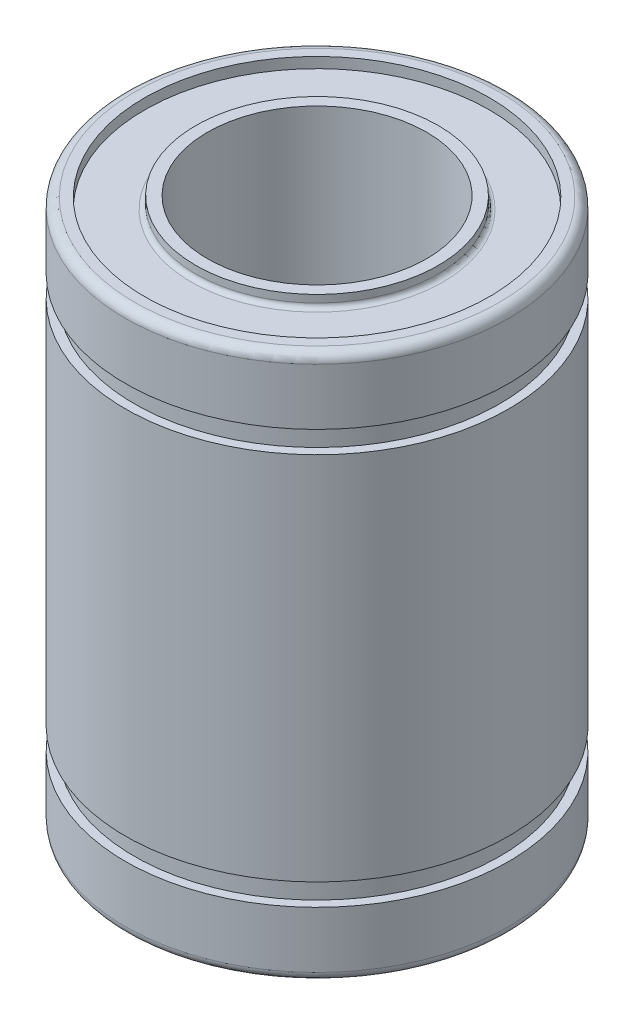
ISO-10303-21;
HEADER;
FILE_DESCRIPTION(('STEP AP214'),'2;1');
FILE_NAME('part.step','',(''),(''),'','','');
FILE_SCHEMA(('AUTOMOTIVE_DESIGN { 1 0 10303 214 1 1 1 1 }'));
ENDSEC;
DATA;
#1=APPLICATION_CONTEXT('core data for automotive mechanical design processes');
#2=APPLICATION_PROTOCOL_DEFINITION('international standard','automotive_design',2000,#1);
#3=PRODUCT_CONTEXT('',#1,'mechanical');
#4=PRODUCT('Part','Part','',(#3));
#5=PRODUCT_RELATED_PRODUCT_CATEGORY('part','',(#4));
#6=PRODUCT_DEFINITION_FORMATION('','',#4);
#7=PRODUCT_DEFINITION_CONTEXT('part definition',#1,'design');
#8=PRODUCT_DEFINITION('design','',#6,#7);
#9=PRODUCT_DEFINITION_SHAPE('','',#8);
#10=(LENGTH_UNIT() NAMED_UNIT(*) SI_UNIT(.MILLI.,.METRE.));
#11=(NAMED_UNIT(*) PLANE_ANGLE_UNIT() SI_UNIT($,.RADIAN.));
#12=(NAMED_UNIT(*) SI_UNIT($,.STERADIAN.) SOLID_ANGLE_UNIT());
#13=UNCERTAINTY_MEASURE_WITH_UNIT(LENGTH_MEASURE(1.E-05),#10,'distance_accuracy_value','');
#14=(GEOMETRIC_REPRESENTATION_CONTEXT(3) GLOBAL_UNCERTAINTY_ASSIGNED_CONTEXT((#13)) GLOBAL_UNIT_ASSIGNED_CONTEXT((#10,
#11,#12)) REPRESENTATION_CONTEXT('',''));
#15=CARTESIAN_POINT('',(0.,0.,0.));
#16=DIRECTION('',(0.,0.,1.));
#17=DIRECTION('',(1.,0.,0.));
#18=AXIS2_PLACEMENT_3D('',#15,#16,#17);
#19=CARTESIAN_POINT('',(0.,15.0004,0.));
#20=DIRECTION('',(0.,-1.,0.));
#21=DIRECTION('',(0.,0.,-1.));
#22=AXIS2_PLACEMENT_3D('',#19,#20,#21);
#23=CYLINDRICAL_SURFACE('',#22,6.635);
#24=CARTESIAN_POINT('',(0.,15.0004,0.));
#25=DIRECTION('',(0.,-1.,0.));
#26=DIRECTION('',(0.,0.,-1.));
#27=AXIS2_PLACEMENT_3D('',#24,#25,#26);
#28=CIRCLE('',#27,6.635);
#29=CARTESIAN_POINT('',(0.,15.0004,-6.635));
#30=VERTEX_POINT('',#29);
#31=EDGE_CURVE('E107',#30,#30,#28,.T.);
#32=ORIENTED_EDGE('',*,*,#31,.T.);
#33=EDGE_LOOP('',(#32));
#34=FACE_BOUND('',#33,.T.);
#35=CARTESIAN_POINT('',(0.,14.594,0.));
#36=DIRECTION('',(0.,-1.,0.));
#37=DIRECTION('',(0.,0.,-1.));
#38=AXIS2_PLACEMENT_3D('',#35,#36,#37);
#39=CIRCLE('',#38,6.635);
#40=CARTESIAN_POINT('',(0.,14.594,-6.635));
#41=VERTEX_POINT('',#40);
#42=EDGE_CURVE('E10',#41,#41,#39,.T.);
#43=ORIENTED_EDGE('',*,*,#42,.F.);
#44=EDGE_LOOP('',(#43));
#45=FACE_BOUND('',#44,.T.);
#46=ADVANCED_FACE('F31',(#34,#45),#23,.T.);
#47=CARTESIAN_POINT('',(0.,14.594,0.));
#48=DIRECTION('',(0.,-1.,0.));
#49=DIRECTION('',(0.,0.,-1.));
#50=AXIS2_PLACEMENT_3D('',#47,#48,#49);
#51=TOROIDAL_SURFACE('',#50,6.889,0.254);
#52=ORIENTED_EDGE('',*,*,#42,.T.);
#53=EDGE_LOOP('',(#52));
#54=FACE_BOUND('',#53,.T.);
#55=CARTESIAN_POINT('',(0.,14.34,0.));
#56=DIRECTION('',(0.,-1.,0.));
#57=DIRECTION('',(0.,0.,-1.));
#58=AXIS2_PLACEMENT_3D('',#55,#56,#57);
#59=CIRCLE('',#58,6.88900000000006);
#60=CARTESIAN_POINT('',(0.,14.34,-6.88900000000006));
#61=VERTEX_POINT('',#60);
#62=EDGE_CURVE('E37',#61,#61,#59,.T.);
#63=ORIENTED_EDGE('',*,*,#62,.F.);
#64=EDGE_LOOP('',(#63));
#65=FACE_BOUND('',#64,.T.);
#66=ADVANCED_FACE('F125',(#54,#65),#51,.F.);
#67=CARTESIAN_POINT('',(9.435,14.34,0.));
#68=DIRECTION('',(0.,1.,0.));
#69=DIRECTION('',(0.,0.,1.));
#70=AXIS2_PLACEMENT_3D('',#67,#68,#69);
#71=PLANE('',#70);
#72=ORIENTED_EDGE('',*,*,#62,.T.);
#73=EDGE_LOOP('',(#72));
#74=FACE_BOUND('',#73,.T.);
#75=CARTESIAN_POINT('',(0.,14.34,0.));
#76=DIRECTION('',(0.,-1.,0.));
#77=DIRECTION('',(0.,0.,-1.));
#78=AXIS2_PLACEMENT_3D('',#75,#76,#77);
#79=CIRCLE('',#78,9.435);
#80=CARTESIAN_POINT('',(0.,14.34,-9.435));
#81=VERTEX_POINT('',#80);
#82=EDGE_CURVE('E41',#81,#81,#79,.T.);
#83=ORIENTED_EDGE('',*,*,#82,.F.);
#84=EDGE_LOOP('',(#83));
#85=FACE_BOUND('',#84,.T.);
#86=ADVANCED_FACE('F129',(#74,#85),#71,.T.);
#87=CARTESIAN_POINT('',(0.,15.0004,0.));
#88=DIRECTION('',(0.,-1.,0.));
#89=DIRECTION('',(0.,0.,-1.));
#90=AXIS2_PLACEMENT_3D('',#87,#88,#89);
#91=CYLINDRICAL_SURFACE('',#90,9.435);
#92=ORIENTED_EDGE('',*,*,#82,.T.);
#93=EDGE_LOOP('',(#92));
#94=FACE_BOUND('',#93,.T.);
#95=CARTESIAN_POINT('',(0.,14.92,0.));
#96=DIRECTION('',(0.,-1.,0.));
#97=DIRECTION('',(0.,0.,-1.));
#98=AXIS2_PLACEMENT_3D('',#95,#96,#97);
#99=CIRCLE('',#98,9.435);
#100=CARTESIAN_POINT('',(0.,14.92,-9.435));
#101=VERTEX_POINT('',#100);
#102=EDGE_CURVE('E45',#101,#101,#99,.T.);
#103=ORIENTED_EDGE('',*,*,#102,.F.);
#104=EDGE_LOOP('',(#103));
#105=FACE_BOUND('',#104,.T.);
#106=ADVANCED_FACE('F133',(#94,#105),#91,.F.);
#107=CARTESIAN_POINT('',(9.977,14.92,0.));
#108=DIRECTION('',(0.,1.,0.));
#109=DIRECTION('',(0.,0.,1.));
#110=AXIS2_PLACEMENT_3D('',#107,#108,#109);
#111=PLANE('',#110);
#112=ORIENTED_EDGE('',*,*,#102,.T.);
#113=EDGE_LOOP('',(#112));
#114=FACE_BOUND('',#113,.T.);
#115=CARTESIAN_POINT('',(0.,14.92,0.));
#116=DIRECTION('',(0.,-1.,0.));
#117=DIRECTION('',(0.,0.,-1.));
#118=AXIS2_PLACEMENT_3D('',#115,#116,#117);
#119=CIRCLE('',#118,9.977);
#120=CARTESIAN_POINT('',(0.,14.92,-9.977));
#121=VERTEX_POINT('',#120);
#122=EDGE_CURVE('E50',#121,#121,#119,.T.);
#123=ORIENTED_EDGE('',*,*,#122,.F.);
#124=EDGE_LOOP('',(#123));
#125=FACE_BOUND('',#124,.T.);
#126=ADVANCED_FACE('F139',(#114,#125),#111,.T.);
#127=CARTESIAN_POINT('',(0.,14.412,0.));
#128=DIRECTION('',(0.,-1.,0.));
#129=DIRECTION('',(0.,0.,-1.));
#130=AXIS2_PLACEMENT_3D('',#127,#128,#129);
#131=TOROIDAL_SURFACE('',#130,9.977,0.508);
#132=ORIENTED_EDGE('',*,*,#122,.T.);
#133=EDGE_LOOP('',(#132));
#134=FACE_BOUND('',#133,.T.);
#135=CARTESIAN_POINT('',(0.,14.412,0.));
#136=DIRECTION('',(0.,-1.,0.));
#137=DIRECTION('',(0.,0.,-1.));
#138=AXIS2_PLACEMENT_3D('',#135,#136,#137);
#139=CIRCLE('',#138,10.485);
#140=CARTESIAN_POINT('',(0.,14.412,-10.485));
#141=VERTEX_POINT('',#140);
#142=EDGE_CURVE('E53',#141,#141,#139,.T.);
#143=ORIENTED_EDGE('',*,*,#142,.F.);
#144=EDGE_LOOP('',(#143));
#145=FACE_BOUND('',#144,.T.);
#146=ADVANCED_FACE('F143',(#134,#145),#131,.T.);
#147=CARTESIAN_POINT('',(0.,15.0004,0.));
#148=DIRECTION('',(0.,-1.,0.));
#149=DIRECTION('',(0.,0.,-1.));
#150=AXIS2_PLACEMENT_3D('',#147,#148,#149);
#151=CYLINDRICAL_SURFACE('',#150,10.485);
#152=ORIENTED_EDGE('',*,*,#142,.T.);
#153=EDGE_LOOP('',(#152));
#154=FACE_BOUND('',#153,.T.);
#155=CARTESIAN_POINT('',(0.,11.325,0.));
#156=DIRECTION('',(0.,-1.,0.));
#157=DIRECTION('',(0.,0.,-1.));
#158=AXIS2_PLACEMENT_3D('',#155,#156,#157);
#159=CIRCLE('',#158,10.485);
#160=CARTESIAN_POINT('',(0.,11.325,-10.485));
#161=VERTEX_POINT('',#160);
#162=EDGE_CURVE('E56',#161,#161,#159,.T.);
#163=ORIENTED_EDGE('',*,*,#162,.F.);
#164=EDGE_LOOP('',(#163));
#165=FACE_BOUND('',#164,.T.);
#166=ADVANCED_FACE('F147',(#154,#165),#151,.T.);
#167=CARTESIAN_POINT('',(10.,11.325,0.));
#168=DIRECTION('',(0.,-1.,0.));
#169=DIRECTION('',(0.,0.,-1.));
#170=AXIS2_PLACEMENT_3D('',#167,#168,#169);
#171=PLANE('',#170);
#172=ORIENTED_EDGE('',*,*,#162,.T.);
#173=EDGE_LOOP('',(#172));
#174=FACE_BOUND('',#173,.T.);
#175=CARTESIAN_POINT('',(0.,11.325,0.));
#176=DIRECTION('',(0.,-1.,0.));
#177=DIRECTION('',(0.,0.,-1.));
#178=AXIS2_PLACEMENT_3D('',#175,#176,#177);
#179=CIRCLE('',#178,10.);
#180=CARTESIAN_POINT('',(0.,11.325,-10.));
#181=VERTEX_POINT('',#180);
#182=EDGE_CURVE('E59',#181,#181,#179,.T.);
#183=ORIENTED_EDGE('',*,*,#182,.F.);
#184=EDGE_LOOP('',(#183));
#185=FACE_BOUND('',#184,.T.);
#186=ADVANCED_FACE('F151',(#174,#185),#171,.T.);
#187=CARTESIAN_POINT('',(0.,15.0004,0.));
#188=DIRECTION('',(0.,-1.,0.));
#189=DIRECTION('',(0.,0.,-1.));
#190=AXIS2_PLACEMENT_3D('',#187,#188,#189);
#191=CYLINDRICAL_SURFACE('',#190,10.);
#192=ORIENTED_EDGE('',*,*,#182,.T.);
#193=EDGE_LOOP('',(#192));
#194=FACE_BOUND('',#193,.T.);
#195=CARTESIAN_POINT('',(0.,10.125,0.));
#196=DIRECTION('',(0.,-1.,0.));
#197=DIRECTION('',(0.,0.,-1.));
#198=AXIS2_PLACEMENT_3D('',#195,#196,#197);
#199=CIRCLE('',#198,10.);
#200=CARTESIAN_POINT('',(0.,10.125,-10.));
#201=VERTEX_POINT('',#200);
#202=EDGE_CURVE('E62',#201,#201,#199,.T.);
#203=ORIENTED_EDGE('',*,*,#202,.F.);
#204=EDGE_LOOP('',(#203));
#205=FACE_BOUND('',#204,.T.);
#206=ADVANCED_FACE('F155',(#194,#205),#191,.T.);
#207=CARTESIAN_POINT('',(10.485,10.125,0.));
#208=DIRECTION('',(0.,1.,0.));
#209=DIRECTION('',(0.,0.,1.));
#210=AXIS2_PLACEMENT_3D('',#207,#208,#209);
#211=PLANE('',#210);
#212=ORIENTED_EDGE('',*,*,#202,.T.);
#213=EDGE_LOOP('',(#212));
#214=FACE_BOUND('',#213,.T.);
#215=CARTESIAN_POINT('',(0.,10.125,0.));
#216=DIRECTION('',(0.,-1.,0.));
#217=DIRECTION('',(0.,0.,-1.));
#218=AXIS2_PLACEMENT_3D('',#215,#216,#217);
#219=CIRCLE('',#218,10.485);
#220=CARTESIAN_POINT('',(0.,10.125,-10.485));
#221=VERTEX_POINT('',#220);
#222=EDGE_CURVE('E65',#221,#221,#219,.T.);
#223=ORIENTED_EDGE('',*,*,#222,.F.);
#224=EDGE_LOOP('',(#223));
#225=FACE_BOUND('',#224,.T.);
#226=ADVANCED_FACE('F159',(#214,#225),#211,.T.);
#227=CARTESIAN_POINT('',(0.,15.0004,0.));
#228=DIRECTION('',(0.,-1.,0.));
#229=DIRECTION('',(0.,0.,-1.));
#230=AXIS2_PLACEMENT_3D('',#227,#228,#229);
#231=CYLINDRICAL_SURFACE('',#230,10.485);
#232=ORIENTED_EDGE('',*,*,#222,.T.);
#233=EDGE_LOOP('',(#232));
#234=FACE_BOUND('',#233,.T.);
#235=CARTESIAN_POINT('',(0.,-10.125,0.));
#236=DIRECTION('',(0.,-1.,0.));
#237=DIRECTION('',(0.,0.,-1.));
#238=AXIS2_PLACEMENT_3D('',#235,#236,#237);
#239=CIRCLE('',#238,10.485);
#240=CARTESIAN_POINT('',(0.,-10.125,-10.485));
#241=VERTEX_POINT('',#240);
#242=EDGE_CURVE('E68',#241,#241,#239,.T.);
#243=ORIENTED_EDGE('',*,*,#242,.F.);
#244=EDGE_LOOP('',(#243));
#245=FACE_BOUND('',#244,.T.);
#246=ADVANCED_FACE('F163',(#234,#245),#231,.T.);
#247=CARTESIAN_POINT('',(10.,-10.125,0.));
#248=DIRECTION('',(0.,-1.,0.));
#249=DIRECTION('',(0.,0.,-1.));
#250=AXIS2_PLACEMENT_3D('',#247,#248,#249);
#251=PLANE('',#250);
#252=ORIENTED_EDGE('',*,*,#242,.T.);
#253=EDGE_LOOP('',(#252));
#254=FACE_BOUND('',#253,.T.);
#255=CARTESIAN_POINT('',(0.,-10.125,0.));
#256=DIRECTION('',(0.,-1.,0.));
#257=DIRECTION('',(0.,0.,-1.));
#258=AXIS2_PLACEMENT_3D('',#255,#256,#257);
#259=CIRCLE('',#258,10.);
#260=CARTESIAN_POINT('',(0.,-10.125,-10.));
#261=VERTEX_POINT('',#260);
#262=EDGE_CURVE('E71',#261,#261,#259,.T.);
#263=ORIENTED_EDGE('',*,*,#262,.F.);
#264=EDGE_LOOP('',(#263));
#265=FACE_BOUND('',#264,.T.);
#266=ADVANCED_FACE('F167',(#254,#265),#251,.T.);
#267=CARTESIAN_POINT('',(0.,15.0004,0.));
#268=DIRECTION('',(0.,-1.,0.));
#269=DIRECTION('',(0.,0.,-1.));
#270=AXIS2_PLACEMENT_3D('',#267,#268,#269);
#271=CYLINDRICAL_SURFACE('',#270,10.);
#272=ORIENTED_EDGE('',*,*,#262,.T.);
#273=EDGE_LOOP('',(#272));
#274=FACE_BOUND('',#273,.T.);
#275=CARTESIAN_POINT('',(0.,-11.325,0.));
#276=DIRECTION('',(0.,-1.,0.));
#277=DIRECTION('',(0.,0.,-1.));
#278=AXIS2_PLACEMENT_3D('',#275,#276,#277);
#279=CIRCLE('',#278,10.);
#280=CARTESIAN_POINT('',(0.,-11.325,-10.));
#281=VERTEX_POINT('',#280);
#282=EDGE_CURVE('E74',#281,#281,#279,.T.);
#283=ORIENTED_EDGE('',*,*,#282,.F.);
#284=EDGE_LOOP('',(#283));
#285=FACE_BOUND('',#284,.T.);
#286=ADVANCED_FACE('F171',(#274,#285),#271,.T.);
#287=CARTESIAN_POINT('',(10.485,-11.325,0.));
#288=DIRECTION('',(0.,1.,0.));
#289=DIRECTION('',(0.,0.,1.));
#290=AXIS2_PLACEMENT_3D('',#287,#288,#289);
#291=PLANE('',#290);
#292=ORIENTED_EDGE('',*,*,#282,.T.);
#293=EDGE_LOOP('',(#292));
#294=FACE_BOUND('',#293,.T.);
#295=CARTESIAN_POINT('',(0.,-11.325,0.));
#296=DIRECTION('',(0.,-1.,0.));
#297=DIRECTION('',(0.,0.,-1.));
#298=AXIS2_PLACEMENT_3D('',#295,#296,#297);
#299=CIRCLE('',#298,10.485);
#300=CARTESIAN_POINT('',(0.,-11.325,-10.485));
#301=VERTEX_POINT('',#300);
#302=EDGE_CURVE('E77',#301,#301,#299,.T.);
#303=ORIENTED_EDGE('',*,*,#302,.F.);
#304=EDGE_LOOP('',(#303));
#305=FACE_BOUND('',#304,.T.);
#306=ADVANCED_FACE('F175',(#294,#305),#291,.T.);
#307=CARTESIAN_POINT('',(0.,15.0004,0.));
#308=DIRECTION('',(0.,-1.,0.));
#309=DIRECTION('',(0.,0.,-1.));
#310=AXIS2_PLACEMENT_3D('',#307,#308,#309);
#311=CYLINDRICAL_SURFACE('',#310,10.485);
#312=ORIENTED_EDGE('',*,*,#302,.T.);
#313=EDGE_LOOP('',(#312));
#314=FACE_BOUND('',#313,.T.);
#315=CARTESIAN_POINT('',(0.,-14.412,0.));
#316=DIRECTION('',(0.,-1.,0.));
#317=DIRECTION('',(0.,0.,-1.));
#318=AXIS2_PLACEMENT_3D('',#315,#316,#317);
#319=CIRCLE('',#318,10.485);
#320=CARTESIAN_POINT('',(0.,-14.412,-10.485));
#321=VERTEX_POINT('',#320);
#322=EDGE_CURVE('E80',#321,#321,#319,.T.);
#323=ORIENTED_EDGE('',*,*,#322,.F.);
#324=EDGE_LOOP('',(#323));
#325=FACE_BOUND('',#324,.T.);
#326=ADVANCED_FACE('F179',(#314,#325),#311,.T.);
#327=CARTESIAN_POINT('',(0.,-14.412,0.));
#328=DIRECTION('',(0.,-1.,0.));
#329=DIRECTION('',(0.,0.,-1.));
#330=AXIS2_PLACEMENT_3D('',#327,#328,#329);
#331=TOROIDAL_SURFACE('',#330,9.977,0.508000000000001);
#332=ORIENTED_EDGE('',*,*,#322,.T.);
#333=EDGE_LOOP('',(#332));
#334=FACE_BOUND('',#333,.T.);
#335=CARTESIAN_POINT('',(0.,-14.92,0.));
#336=DIRECTION('',(0.,-1.,0.));
#337=DIRECTION('',(0.,0.,-1.));
#338=AXIS2_PLACEMENT_3D('',#335,#336,#337);
#339=CIRCLE('',#338,9.97700000000004);
#340=CARTESIAN_POINT('',(0.,-14.92,-9.97700000000004));
#341=VERTEX_POINT('',#340);
#342=EDGE_CURVE('E83',#341,#341,#339,.T.);
#343=ORIENTED_EDGE('',*,*,#342,.F.);
#344=EDGE_LOOP('',(#343));
#345=FACE_BOUND('',#344,.T.);
#346=ADVANCED_FACE('F183',(#334,#345),#331,.T.);
#347=CARTESIAN_POINT('',(9.435,-14.92,0.));
#348=DIRECTION('',(0.,-1.,0.));
#349=DIRECTION('',(0.,0.,-1.));
#350=AXIS2_PLACEMENT_3D('',#347,#348,#349);
#351=PLANE('',#350);
#352=ORIENTED_EDGE('',*,*,#342,.T.);
#353=EDGE_LOOP('',(#352));
#354=FACE_BOUND('',#353,.T.);
#355=CARTESIAN_POINT('',(0.,-14.92,0.));
#356=DIRECTION('',(0.,-1.,0.));
#357=DIRECTION('',(0.,0.,-1.));
#358=AXIS2_PLACEMENT_3D('',#355,#356,#357);
#359=CIRCLE('',#358,9.435);
#360=CARTESIAN_POINT('',(0.,-14.92,-9.435));
#361=VERTEX_POINT('',#360);
#362=EDGE_CURVE('E86',#361,#361,#359,.T.);
#363=ORIENTED_EDGE('',*,*,#362,.F.);
#364=EDGE_LOOP('',(#363));
#365=FACE_BOUND('',#364,.T.);
#366=ADVANCED_FACE('F187',(#354,#365),#351,.T.);
#367=CARTESIAN_POINT('',(0.,15.0004,0.));
#368=DIRECTION('',(0.,-1.,0.));
#369=DIRECTION('',(0.,0.,-1.));
#370=AXIS2_PLACEMENT_3D('',#367,#368,#369);
#371=CYLINDRICAL_SURFACE('',#370,9.435);
#372=ORIENTED_EDGE('',*,*,#362,.T.);
#373=EDGE_LOOP('',(#372));
#374=FACE_BOUND('',#373,.T.);
#375=CARTESIAN_POINT('',(0.,-14.34,0.));
#376=DIRECTION('',(0.,-1.,0.));
#377=DIRECTION('',(0.,0.,-1.));
#378=AXIS2_PLACEMENT_3D('',#375,#376,#377);
#379=CIRCLE('',#378,9.435);
#380=CARTESIAN_POINT('',(0.,-14.34,-9.435));
#381=VERTEX_POINT('',#380);
#382=EDGE_CURVE('E89',#381,#381,#379,.T.);
#383=ORIENTED_EDGE('',*,*,#382,.F.);
#384=EDGE_LOOP('',(#383));
#385=FACE_BOUND('',#384,.T.);
#386=ADVANCED_FACE('F191',(#374,#385),#371,.F.);
#387=CARTESIAN_POINT('',(6.889,-14.34,0.));
#388=DIRECTION('',(0.,-1.,0.));
#389=DIRECTION('',(0.,0.,-1.));
#390=AXIS2_PLACEMENT_3D('',#387,#388,#389);
#391=PLANE('',#390);
#392=ORIENTED_EDGE('',*,*,#382,.T.);
#393=EDGE_LOOP('',(#392));
#394=FACE_BOUND('',#393,.T.);
#395=CARTESIAN_POINT('',(0.,-14.34,0.));
#396=DIRECTION('',(0.,-1.,0.));
#397=DIRECTION('',(0.,0.,-1.));
#398=AXIS2_PLACEMENT_3D('',#395,#396,#397);
#399=CIRCLE('',#398,6.889);
#400=CARTESIAN_POINT('',(0.,-14.34,-6.889));
#401=VERTEX_POINT('',#400);
#402=EDGE_CURVE('E92',#401,#401,#399,.T.);
#403=ORIENTED_EDGE('',*,*,#402,.F.);
#404=EDGE_LOOP('',(#403));
#405=FACE_BOUND('',#404,.T.);
#406=ADVANCED_FACE('F195',(#394,#405),#391,.T.);
#407=CARTESIAN_POINT('',(0.,-14.594,0.));
#408=DIRECTION('',(0.,-1.,0.));
#409=DIRECTION('',(0.,0.,-1.));
#410=AXIS2_PLACEMENT_3D('',#407,#408,#409);
#411=TOROIDAL_SURFACE('',#410,6.889,0.254);
#412=ORIENTED_EDGE('',*,*,#402,.T.);
#413=EDGE_LOOP('',(#412));
#414=FACE_BOUND('',#413,.T.);
#415=CARTESIAN_POINT('',(0.,-14.594,0.));
#416=DIRECTION('',(0.,-1.,0.));
#417=DIRECTION('',(0.,0.,-1.));
#418=AXIS2_PLACEMENT_3D('',#415,#416,#417);
#419=CIRCLE('',#418,6.635);
#420=CARTESIAN_POINT('',(0.,-14.594,-6.635));
#421=VERTEX_POINT('',#420);
#422=EDGE_CURVE('E95',#421,#421,#419,.T.);
#423=ORIENTED_EDGE('',*,*,#422,.F.);
#424=EDGE_LOOP('',(#423));
#425=FACE_BOUND('',#424,.T.);
#426=ADVANCED_FACE('F199',(#414,#425),#411,.F.);
#427=CARTESIAN_POINT('',(0.,15.0004,0.));
#428=DIRECTION('',(0.,-1.,0.));
#429=DIRECTION('',(0.,0.,-1.));
#430=AXIS2_PLACEMENT_3D('',#427,#428,#429);
#431=CYLINDRICAL_SURFACE('',#430,6.635);
#432=ORIENTED_EDGE('',*,*,#422,.T.);
#433=EDGE_LOOP('',(#432));
#434=FACE_BOUND('',#433,.T.);
#435=CARTESIAN_POINT('',(0.,-15.0004,0.));
#436=DIRECTION('',(0.,-1.,0.));
#437=DIRECTION('',(0.,0.,-1.));
#438=AXIS2_PLACEMENT_3D('',#435,#436,#437);
#439=CIRCLE('',#438,6.635);
#440=CARTESIAN_POINT('',(0.,-15.0004,-6.635));
#441=VERTEX_POINT('',#440);
#442=EDGE_CURVE('E98',#441,#441,#439,.T.);
#443=ORIENTED_EDGE('',*,*,#442,.F.);
#444=EDGE_LOOP('',(#443));
#445=FACE_BOUND('',#444,.T.);
#446=ADVANCED_FACE('F203',(#434,#445),#431,.T.);
#447=CARTESIAN_POINT('',(6.,-15.0004,0.));
#448=DIRECTION('',(0.,-1.,0.));
#449=DIRECTION('',(0.,0.,-1.));
#450=AXIS2_PLACEMENT_3D('',#447,#448,#449);
#451=PLANE('',#450);
#452=ORIENTED_EDGE('',*,*,#442,.T.);
#453=EDGE_LOOP('',(#452));
#454=FACE_BOUND('',#453,.T.);
#455=CARTESIAN_POINT('',(0.,-15.0004,0.));
#456=DIRECTION('',(0.,-1.,0.));
#457=DIRECTION('',(0.,0.,-1.));
#458=AXIS2_PLACEMENT_3D('',#455,#456,#457);
#459=CIRCLE('',#458,6.);
#460=CARTESIAN_POINT('',(0.,-15.0004,-6.));
#461=VERTEX_POINT('',#460);
#462=EDGE_CURVE('E101',#461,#461,#459,.T.);
#463=ORIENTED_EDGE('',*,*,#462,.F.);
#464=EDGE_LOOP('',(#463));
#465=FACE_BOUND('',#464,.T.);
#466=ADVANCED_FACE('F121',(#454,#465),#451,.T.);
#467=CARTESIAN_POINT('',(0.,15.0004,0.));
#468=DIRECTION('',(0.,-1.,0.));
#469=DIRECTION('',(0.,0.,-1.));
#470=AXIS2_PLACEMENT_3D('',#467,#468,#469);
#471=CYLINDRICAL_SURFACE('',#470,6.);
#472=ORIENTED_EDGE('',*,*,#462,.T.);
#473=EDGE_LOOP('',(#472));
#474=FACE_BOUND('',#473,.T.);
#475=CARTESIAN_POINT('',(0.,15.0004,0.));
#476=DIRECTION('',(0.,-1.,0.));
#477=DIRECTION('',(0.,0.,-1.));
#478=AXIS2_PLACEMENT_3D('',#475,#476,#477);
#479=CIRCLE('',#478,6.);
#480=CARTESIAN_POINT('',(0.,15.0004,-6.));
#481=VERTEX_POINT('',#480);
#482=EDGE_CURVE('E104',#481,#481,#479,.T.);
#483=ORIENTED_EDGE('',*,*,#482,.F.);
#484=EDGE_LOOP('',(#483));
#485=FACE_BOUND('',#484,.T.);
#486=ADVANCED_FACE('F115',(#474,#485),#471,.F.);
#487=CARTESIAN_POINT('',(6.635,15.0004,0.));
#488=DIRECTION('',(0.,1.,0.));
#489=DIRECTION('',(0.,0.,1.));
#490=AXIS2_PLACEMENT_3D('',#487,#488,#489);
#491=PLANE('',#490);
#492=ORIENTED_EDGE('',*,*,#482,.T.);
#493=EDGE_LOOP('',(#492));
#494=FACE_BOUND('',#493,.T.);
#495=ORIENTED_EDGE('',*,*,#31,.F.);
#496=EDGE_LOOP('',(#495));
#497=FACE_BOUND('',#496,.T.);
#498=ADVANCED_FACE('F113',(#494,#497),#491,.T.);
#499=CLOSED_SHELL('',(#46,#66,#86,#106,#126,#146,#166,#186,#206,#226,#246,#266,#286,#306,#326,
#346,#366,#386,#406,#426,#446,#466,#486,#498));
#500=MANIFOLD_SOLID_BREP('B2',#499);
#501=ADVANCED_BREP_SHAPE_REPRESENTATION('',(#18,#500),#14);
#502=SHAPE_DEFINITION_REPRESENTATION(#9,#501);
ENDSEC;
END-ISO-10303-21;
